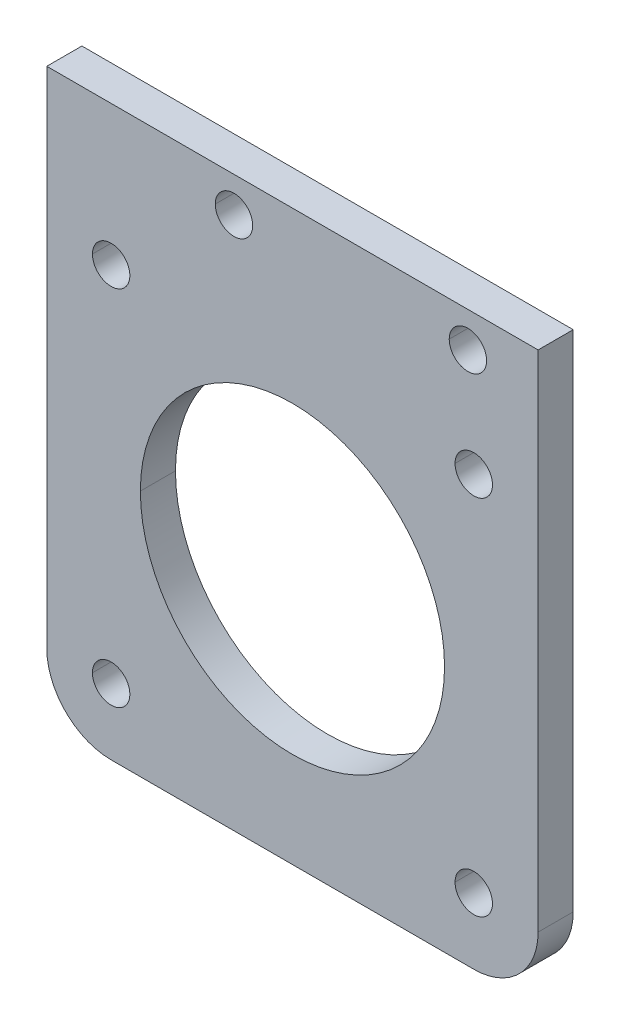
ISO-10303-21;
HEADER;
FILE_DESCRIPTION(('STEP AP214'),'2;1');
FILE_NAME('part.step','',(''),(''),'','','');
FILE_SCHEMA(('AUTOMOTIVE_DESIGN { 1 0 10303 214 1 1 1 1 }'));
ENDSEC;
DATA;
#1=APPLICATION_CONTEXT('core data for automotive mechanical design processes');
#2=APPLICATION_PROTOCOL_DEFINITION('international standard','automotive_design',2000,#1);
#3=PRODUCT_CONTEXT('',#1,'mechanical');
#4=PRODUCT('Part','Part','',(#3));
#5=PRODUCT_RELATED_PRODUCT_CATEGORY('part','',(#4));
#6=PRODUCT_DEFINITION_FORMATION('','',#4);
#7=PRODUCT_DEFINITION_CONTEXT('part definition',#1,'design');
#8=PRODUCT_DEFINITION('design','',#6,#7);
#9=PRODUCT_DEFINITION_SHAPE('','',#8);
#10=(LENGTH_UNIT() NAMED_UNIT(*) SI_UNIT(.MILLI.,.METRE.));
#11=(NAMED_UNIT(*) PLANE_ANGLE_UNIT() SI_UNIT($,.RADIAN.));
#12=(NAMED_UNIT(*) SI_UNIT($,.STERADIAN.) SOLID_ANGLE_UNIT());
#13=UNCERTAINTY_MEASURE_WITH_UNIT(LENGTH_MEASURE(1.E-05),#10,'distance_accuracy_value','');
#14=(GEOMETRIC_REPRESENTATION_CONTEXT(3) GLOBAL_UNCERTAINTY_ASSIGNED_CONTEXT((#13)) GLOBAL_UNIT_ASSIGNED_CONTEXT((#10,
#11,#12)) REPRESENTATION_CONTEXT('',''));
#15=CARTESIAN_POINT('',(0.,0.,0.));
#16=DIRECTION('',(0.,0.,1.));
#17=DIRECTION('',(1.,0.,0.));
#18=AXIS2_PLACEMENT_3D('',#15,#16,#17);
#19=CARTESIAN_POINT('',(-15.5,-15.65,10.));
#20=DIRECTION('',(0.,0.,-1.));
#21=DIRECTION('',(-1.,0.,0.));
#22=AXIS2_PLACEMENT_3D('',#19,#20,#21);
#23=CYLINDRICAL_SURFACE('',#22,5.5);
#24=CARTESIAN_POINT('',(-15.5,-15.65,3.));
#25=DIRECTION('',(0.,0.,1.));
#26=DIRECTION('',(1.,0.,0.));
#27=AXIS2_PLACEMENT_3D('',#24,#25,#26);
#28=CIRCLE('',#27,5.5);
#29=CARTESIAN_POINT('',(-21.,-15.65,3.));
#30=VERTEX_POINT('',#29);
#31=CARTESIAN_POINT('',(-15.5,-21.15,3.));
#32=VERTEX_POINT('',#31);
#33=EDGE_CURVE('E218',#30,#32,#28,.T.);
#34=ORIENTED_EDGE('',*,*,#33,.F.);
#35=DIRECTION('',(0.,0.,1.));
#36=VECTOR('',#35,1.);
#37=CARTESIAN_POINT('',(-21.,-15.65,3.));
#38=LINE('',#37,#36);
#39=CARTESIAN_POINT('',(-21.,-15.65,0.));
#40=VERTEX_POINT('',#39);
#41=EDGE_CURVE('E237',#40,#30,#38,.T.);
#42=ORIENTED_EDGE('',*,*,#41,.F.);
#43=CARTESIAN_POINT('',(-15.5,-15.65,0.));
#44=DIRECTION('',(0.,0.,-1.));
#45=DIRECTION('',(1.,0.,0.));
#46=AXIS2_PLACEMENT_3D('',#43,#44,#45);
#47=CIRCLE('',#46,5.5);
#48=CARTESIAN_POINT('',(-15.5,-21.15,0.));
#49=VERTEX_POINT('',#48);
#50=EDGE_CURVE('E245',#49,#40,#47,.T.);
#51=ORIENTED_EDGE('',*,*,#50,.F.);
#52=DIRECTION('',(0.,0.,-1.));
#53=VECTOR('',#52,1.);
#54=CARTESIAN_POINT('',(-15.5,-21.15,10.));
#55=LINE('',#54,#53);
#56=EDGE_CURVE('E11',#32,#49,#55,.T.);
#57=ORIENTED_EDGE('',*,*,#56,.F.);
#58=EDGE_LOOP('',(#34,#42,#51,#57));
#59=FACE_BOUND('',#58,.T.);
#60=ADVANCED_FACE('F17',(#59),#23,.T.);
#61=CARTESIAN_POINT('',(15.5,-15.65,3.));
#62=DIRECTION('',(0.,0.,1.));
#63=DIRECTION('',(1.,0.,0.));
#64=AXIS2_PLACEMENT_3D('',#61,#62,#63);
#65=CYLINDRICAL_SURFACE('',#64,5.5);
#66=CARTESIAN_POINT('',(15.5,-15.65,3.));
#67=DIRECTION('',(0.,0.,1.));
#68=DIRECTION('',(1.,0.,0.));
#69=AXIS2_PLACEMENT_3D('',#66,#67,#68);
#70=CIRCLE('',#69,5.5);
#71=CARTESIAN_POINT('',(15.5,-21.15,3.));
#72=VERTEX_POINT('',#71);
#73=CARTESIAN_POINT('',(21.,-15.65,3.));
#74=VERTEX_POINT('',#73);
#75=EDGE_CURVE('E21',#72,#74,#70,.T.);
#76=ORIENTED_EDGE('',*,*,#75,.F.);
#77=DIRECTION('',(0.,0.,1.));
#78=VECTOR('',#77,1.);
#79=CARTESIAN_POINT('',(15.5,-21.15,3.));
#80=LINE('',#79,#78);
#81=CARTESIAN_POINT('',(15.5,-21.15,0.));
#82=VERTEX_POINT('',#81);
#83=EDGE_CURVE('E28',#82,#72,#80,.T.);
#84=ORIENTED_EDGE('',*,*,#83,.F.);
#85=CARTESIAN_POINT('',(15.5,-15.65,0.));
#86=DIRECTION('',(0.,0.,-1.));
#87=DIRECTION('',(1.,0.,0.));
#88=AXIS2_PLACEMENT_3D('',#85,#86,#87);
#89=CIRCLE('',#88,5.5);
#90=CARTESIAN_POINT('',(21.,-15.65,0.));
#91=VERTEX_POINT('',#90);
#92=EDGE_CURVE('E246',#91,#82,#89,.T.);
#93=ORIENTED_EDGE('',*,*,#92,.F.);
#94=DIRECTION('',(0.,0.,-1.));
#95=VECTOR('',#94,1.);
#96=CARTESIAN_POINT('',(21.,-15.65,0.));
#97=LINE('',#96,#95);
#98=EDGE_CURVE('E209',#74,#91,#97,.T.);
#99=ORIENTED_EDGE('',*,*,#98,.F.);
#100=EDGE_LOOP('',(#76,#84,#93,#99));
#101=FACE_BOUND('',#100,.T.);
#102=ADVANCED_FACE('F207',(#101),#65,.T.);
#103=CARTESIAN_POINT('',(-4.99999999999984,24.4499999999959,10.));
#104=DIRECTION('',(0.,0.,-1.));
#105=DIRECTION('',(-1.,0.,0.));
#106=AXIS2_PLACEMENT_3D('',#103,#104,#105);
#107=CYLINDRICAL_SURFACE('',#106,1.6);
#108=DIRECTION('',(0.,0.,-1.));
#109=VECTOR('',#108,1.);
#110=CARTESIAN_POINT('',(-3.39999999999984,24.4499999999959,10.));
#111=LINE('',#110,#109);
#112=CARTESIAN_POINT('',(-3.39999999999984,24.4499999999959,3.));
#113=VERTEX_POINT('',#112);
#114=CARTESIAN_POINT('',(-3.39999999999984,24.4499999999959,0.));
#115=VERTEX_POINT('',#114);
#116=EDGE_CURVE('E242',#113,#115,#111,.T.);
#117=ORIENTED_EDGE('',*,*,#116,.F.);
#118=CARTESIAN_POINT('',(-4.99999999999984,24.4499999999959,3.));
#119=DIRECTION('',(0.,0.,1.));
#120=DIRECTION('',(1.,0.,0.));
#121=AXIS2_PLACEMENT_3D('',#118,#119,#120);
#122=CIRCLE('',#121,1.6);
#123=CARTESIAN_POINT('',(-6.59999999999984,24.4499999999959,3.));
#124=VERTEX_POINT('',#123);
#125=EDGE_CURVE('E282',#113,#124,#122,.T.);
#126=ORIENTED_EDGE('',*,*,#125,.T.);
#127=DIRECTION('',(0.,0.,-1.));
#128=VECTOR('',#127,1.);
#129=CARTESIAN_POINT('',(-6.59999999999984,24.4499999999959,10.));
#130=LINE('',#129,#128);
#131=CARTESIAN_POINT('',(-6.59999999999984,24.4499999999959,0.));
#132=VERTEX_POINT('',#131);
#133=EDGE_CURVE('E299',#124,#132,#130,.T.);
#134=ORIENTED_EDGE('',*,*,#133,.T.);
#135=CARTESIAN_POINT('',(-4.99999999999984,24.4499999999959,0.));
#136=DIRECTION('',(0.,0.,-1.));
#137=DIRECTION('',(-1.,0.,0.));
#138=AXIS2_PLACEMENT_3D('',#135,#136,#137);
#139=CIRCLE('',#138,1.6);
#140=EDGE_CURVE('E294',#132,#115,#139,.T.);
#141=ORIENTED_EDGE('',*,*,#140,.T.);
#142=EDGE_LOOP('',(#117,#126,#134,#141));
#143=FACE_BOUND('',#142,.T.);
#144=ADVANCED_FACE('F450',(#143),#107,.F.);
#145=CARTESIAN_POINT('',(15.,24.4499999999959,10.));
#146=DIRECTION('',(0.,0.,-1.));
#147=DIRECTION('',(-1.,0.,0.));
#148=AXIS2_PLACEMENT_3D('',#145,#146,#147);
#149=CYLINDRICAL_SURFACE('',#148,1.6);
#150=DIRECTION('',(0.,0.,-1.));
#151=VECTOR('',#150,1.);
#152=CARTESIAN_POINT('',(16.6,24.4499999999959,10.));
#153=LINE('',#152,#151);
#154=CARTESIAN_POINT('',(16.6,24.4499999999959,3.));
#155=VERTEX_POINT('',#154);
#156=CARTESIAN_POINT('',(16.6,24.4499999999959,0.));
#157=VERTEX_POINT('',#156);
#158=EDGE_CURVE('E273',#155,#157,#153,.T.);
#159=ORIENTED_EDGE('',*,*,#158,.F.);
#160=CARTESIAN_POINT('',(15.,24.4499999999959,3.));
#161=DIRECTION('',(0.,0.,1.));
#162=DIRECTION('',(1.,0.,0.));
#163=AXIS2_PLACEMENT_3D('',#160,#161,#162);
#164=CIRCLE('',#163,1.6);
#165=CARTESIAN_POINT('',(13.4000000000002,24.4499999999959,3.));
#166=VERTEX_POINT('',#165);
#167=EDGE_CURVE('E252',#155,#166,#164,.T.);
#168=ORIENTED_EDGE('',*,*,#167,.T.);
#169=DIRECTION('',(0.,0.,-1.));
#170=VECTOR('',#169,1.);
#171=CARTESIAN_POINT('',(13.4000000000002,24.4499999999959,10.));
#172=LINE('',#171,#170);
#173=CARTESIAN_POINT('',(13.4000000000002,24.4499999999959,0.));
#174=VERTEX_POINT('',#173);
#175=EDGE_CURVE('E228',#166,#174,#172,.T.);
#176=ORIENTED_EDGE('',*,*,#175,.T.);
#177=CARTESIAN_POINT('',(15.,24.4499999999959,0.));
#178=DIRECTION('',(0.,0.,-1.));
#179=DIRECTION('',(-1.,0.,0.));
#180=AXIS2_PLACEMENT_3D('',#177,#178,#179);
#181=CIRCLE('',#180,1.6);
#182=EDGE_CURVE('E278',#174,#157,#181,.T.);
#183=ORIENTED_EDGE('',*,*,#182,.T.);
#184=EDGE_LOOP('',(#159,#168,#176,#183));
#185=FACE_BOUND('',#184,.T.);
#186=ADVANCED_FACE('F490',(#185),#149,.F.);
#187=CARTESIAN_POINT('',(0.,27.45,3.000012));
#188=DIRECTION('',(0.,1.,0.));
#189=DIRECTION('',(1.,0.,0.));
#190=AXIS2_PLACEMENT_3D('',#187,#188,#189);
#191=PLANE('',#190);
#192=DIRECTION('',(0.,0.,-1.));
#193=VECTOR('',#192,1.);
#194=CARTESIAN_POINT('',(21.,27.45,3.000012));
#195=LINE('',#194,#193);
#196=CARTESIAN_POINT('',(21.,27.45,3.));
#197=VERTEX_POINT('',#196);
#198=CARTESIAN_POINT('',(21.,27.45,0.));
#199=VERTEX_POINT('',#198);
#200=EDGE_CURVE('E257',#197,#199,#195,.T.);
#201=ORIENTED_EDGE('',*,*,#200,.T.);
#202=DIRECTION('',(-1.,0.,0.));
#203=VECTOR('',#202,1.);
#204=CARTESIAN_POINT('',(0.,27.45,0.));
#205=LINE('',#204,#203);
#206=CARTESIAN_POINT('',(-21.,27.45,0.));
#207=VERTEX_POINT('',#206);
#208=EDGE_CURVE('E341',#199,#207,#205,.T.);
#209=ORIENTED_EDGE('',*,*,#208,.T.);
#210=DIRECTION('',(0.,0.,-1.));
#211=VECTOR('',#210,1.);
#212=CARTESIAN_POINT('',(-21.,27.45,3.000012));
#213=LINE('',#212,#211);
#214=CARTESIAN_POINT('',(-21.,27.45,3.));
#215=VERTEX_POINT('',#214);
#216=EDGE_CURVE('E220',#215,#207,#213,.T.);
#217=ORIENTED_EDGE('',*,*,#216,.F.);
#218=DIRECTION('',(-1.,0.,0.));
#219=VECTOR('',#218,1.);
#220=CARTESIAN_POINT('',(0.,27.45,3.));
#221=LINE('',#220,#219);
#222=EDGE_CURVE('E214',#197,#215,#221,.T.);
#223=ORIENTED_EDGE('',*,*,#222,.F.);
#224=EDGE_LOOP('',(#201,#209,#217,#223));
#225=FACE_BOUND('',#224,.T.);
#226=ADVANCED_FACE('F463',(#225),#191,.T.);
#227=CARTESIAN_POINT('',(0.,-21.15,10.));
#228=DIRECTION('',(0.,-1.,0.));
#229=DIRECTION('',(0.,0.,-1.));
#230=AXIS2_PLACEMENT_3D('',#227,#228,#229);
#231=PLANE('',#230);
#232=DIRECTION('',(-1.,0.,0.));
#233=VECTOR('',#232,1.);
#234=CARTESIAN_POINT('',(0.,-21.15,0.));
#235=LINE('',#234,#233);
#236=EDGE_CURVE('E200',#82,#49,#235,.T.);
#237=ORIENTED_EDGE('',*,*,#236,.F.);
#238=ORIENTED_EDGE('',*,*,#83,.T.);
#239=DIRECTION('',(1.,0.,0.));
#240=VECTOR('',#239,1.);
#241=CARTESIAN_POINT('',(0.,-21.15,3.));
#242=LINE('',#241,#240);
#243=EDGE_CURVE('E198',#32,#72,#242,.T.);
#244=ORIENTED_EDGE('',*,*,#243,.F.);
#245=ORIENTED_EDGE('',*,*,#56,.T.);
#246=EDGE_LOOP('',(#237,#238,#244,#245));
#247=FACE_BOUND('',#246,.T.);
#248=ADVANCED_FACE('F196',(#247),#231,.T.);
#249=CARTESIAN_POINT('',(0.,0.,3.));
#250=DIRECTION('',(0.,0.,-1.));
#251=DIRECTION('',(-1.,0.,0.));
#252=AXIS2_PLACEMENT_3D('',#249,#250,#251);
#253=CYLINDRICAL_SURFACE('',#252,13.);
#254=DIRECTION('',(0.,0.,-1.));
#255=VECTOR('',#254,1.);
#256=CARTESIAN_POINT('',(13.,0.,3.));
#257=LINE('',#256,#255);
#258=CARTESIAN_POINT('',(13.,0.,3.));
#259=VERTEX_POINT('',#258);
#260=CARTESIAN_POINT('',(13.,0.,0.));
#261=VERTEX_POINT('',#260);
#262=EDGE_CURVE('E316',#259,#261,#257,.T.);
#263=ORIENTED_EDGE('',*,*,#262,.F.);
#264=CARTESIAN_POINT('',(0.,0.,3.));
#265=DIRECTION('',(0.,0.,1.));
#266=DIRECTION('',(1.,0.,0.));
#267=AXIS2_PLACEMENT_3D('',#264,#265,#266);
#268=CIRCLE('',#267,13.);
#269=CARTESIAN_POINT('',(-13.,0.,3.));
#270=VERTEX_POINT('',#269);
#271=EDGE_CURVE('E308',#259,#270,#268,.T.);
#272=ORIENTED_EDGE('',*,*,#271,.T.);
#273=DIRECTION('',(0.,0.,-1.));
#274=VECTOR('',#273,1.);
#275=CARTESIAN_POINT('',(-13.,0.,3.));
#276=LINE('',#275,#274);
#277=CARTESIAN_POINT('',(-13.,0.,0.));
#278=VERTEX_POINT('',#277);
#279=EDGE_CURVE('E264',#270,#278,#276,.T.);
#280=ORIENTED_EDGE('',*,*,#279,.T.);
#281=CARTESIAN_POINT('',(0.,0.,0.));
#282=DIRECTION('',(0.,0.,1.));
#283=DIRECTION('',(1.,0.,0.));
#284=AXIS2_PLACEMENT_3D('',#281,#282,#283);
#285=CIRCLE('',#284,13.);
#286=EDGE_CURVE('E204',#261,#278,#285,.T.);
#287=ORIENTED_EDGE('',*,*,#286,.F.);
#288=EDGE_LOOP('',(#263,#272,#280,#287));
#289=FACE_BOUND('',#288,.T.);
#290=ADVANCED_FACE('F504',(#289),#253,.F.);
#291=CARTESIAN_POINT('',(15.5,-15.5,3.));
#292=DIRECTION('',(0.,0.,-1.));
#293=DIRECTION('',(-1.,0.,0.));
#294=AXIS2_PLACEMENT_3D('',#291,#292,#293);
#295=CYLINDRICAL_SURFACE('',#294,1.6);
#296=DIRECTION('',(0.,0.,-1.));
#297=VECTOR('',#296,1.);
#298=CARTESIAN_POINT('',(17.1,-15.5,3.));
#299=LINE('',#298,#297);
#300=CARTESIAN_POINT('',(17.1,-15.5,3.));
#301=VERTEX_POINT('',#300);
#302=CARTESIAN_POINT('',(17.1,-15.5,0.));
#303=VERTEX_POINT('',#302);
#304=EDGE_CURVE('E328',#301,#303,#299,.T.);
#305=ORIENTED_EDGE('',*,*,#304,.F.);
#306=CARTESIAN_POINT('',(15.5,-15.5,3.));
#307=DIRECTION('',(0.,0.,1.));
#308=DIRECTION('',(1.,0.,0.));
#309=AXIS2_PLACEMENT_3D('',#306,#307,#308);
#310=CIRCLE('',#309,1.6);
#311=CARTESIAN_POINT('',(13.9,-15.5,3.));
#312=VERTEX_POINT('',#311);
#313=EDGE_CURVE('E247',#301,#312,#310,.T.);
#314=ORIENTED_EDGE('',*,*,#313,.T.);
#315=DIRECTION('',(0.,0.,-1.));
#316=VECTOR('',#315,1.);
#317=CARTESIAN_POINT('',(13.9,-15.5,3.));
#318=LINE('',#317,#316);
#319=CARTESIAN_POINT('',(13.9,-15.5,0.));
#320=VERTEX_POINT('',#319);
#321=EDGE_CURVE('E331',#312,#320,#318,.T.);
#322=ORIENTED_EDGE('',*,*,#321,.T.);
#323=CARTESIAN_POINT('',(15.5,-15.5,0.));
#324=DIRECTION('',(0.,0.,1.));
#325=DIRECTION('',(1.,0.,0.));
#326=AXIS2_PLACEMENT_3D('',#323,#324,#325);
#327=CIRCLE('',#326,1.6);
#328=EDGE_CURVE('E274',#303,#320,#327,.T.);
#329=ORIENTED_EDGE('',*,*,#328,.F.);
#330=EDGE_LOOP('',(#305,#314,#322,#329));
#331=FACE_BOUND('',#330,.T.);
#332=ADVANCED_FACE('F528',(#331),#295,.F.);
#333=CARTESIAN_POINT('',(-15.5,15.5,3.));
#334=DIRECTION('',(0.,0.,-1.));
#335=DIRECTION('',(-1.,0.,0.));
#336=AXIS2_PLACEMENT_3D('',#333,#334,#335);
#337=CYLINDRICAL_SURFACE('',#336,1.6);
#338=DIRECTION('',(0.,0.,-1.));
#339=VECTOR('',#338,1.);
#340=CARTESIAN_POINT('',(-13.9,15.5,3.));
#341=LINE('',#340,#339);
#342=CARTESIAN_POINT('',(-13.9,15.5,3.));
#343=VERTEX_POINT('',#342);
#344=CARTESIAN_POINT('',(-13.9,15.5,0.));
#345=VERTEX_POINT('',#344);
#346=EDGE_CURVE('E353',#343,#345,#341,.T.);
#347=ORIENTED_EDGE('',*,*,#346,.F.);
#348=CARTESIAN_POINT('',(-15.5,15.5,3.));
#349=DIRECTION('',(0.,0.,1.));
#350=DIRECTION('',(1.,0.,0.));
#351=AXIS2_PLACEMENT_3D('',#348,#349,#350);
#352=CIRCLE('',#351,1.6);
#353=CARTESIAN_POINT('',(-17.1,15.5,3.));
#354=VERTEX_POINT('',#353);
#355=EDGE_CURVE('E251',#343,#354,#352,.T.);
#356=ORIENTED_EDGE('',*,*,#355,.T.);
#357=DIRECTION('',(0.,0.,-1.));
#358=VECTOR('',#357,1.);
#359=CARTESIAN_POINT('',(-17.1,15.5,3.));
#360=LINE('',#359,#358);
#361=CARTESIAN_POINT('',(-17.1,15.5,0.));
#362=VERTEX_POINT('',#361);
#363=EDGE_CURVE('E342',#354,#362,#360,.T.);
#364=ORIENTED_EDGE('',*,*,#363,.T.);
#365=CARTESIAN_POINT('',(-15.5,15.5,0.));
#366=DIRECTION('',(0.,0.,1.));
#367=DIRECTION('',(1.,0.,0.));
#368=AXIS2_PLACEMENT_3D('',#365,#366,#367);
#369=CIRCLE('',#368,1.6);
#370=EDGE_CURVE('E277',#345,#362,#369,.T.);
#371=ORIENTED_EDGE('',*,*,#370,.F.);
#372=EDGE_LOOP('',(#347,#356,#364,#371));
#373=FACE_BOUND('',#372,.T.);
#374=ADVANCED_FACE('F427',(#373),#337,.F.);
#375=CARTESIAN_POINT('',(15.5,15.5,3.));
#376=DIRECTION('',(0.,0.,-1.));
#377=DIRECTION('',(-1.,0.,0.));
#378=AXIS2_PLACEMENT_3D('',#375,#376,#377);
#379=CYLINDRICAL_SURFACE('',#378,1.6);
#380=DIRECTION('',(0.,0.,-1.));
#381=VECTOR('',#380,1.);
#382=CARTESIAN_POINT('',(17.1,15.5,3.));
#383=LINE('',#382,#381);
#384=CARTESIAN_POINT('',(17.1,15.5,3.));
#385=VERTEX_POINT('',#384);
#386=CARTESIAN_POINT('',(17.1,15.5,0.));
#387=VERTEX_POINT('',#386);
#388=EDGE_CURVE('E364',#385,#387,#383,.T.);
#389=ORIENTED_EDGE('',*,*,#388,.F.);
#390=CARTESIAN_POINT('',(15.5,15.5,3.));
#391=DIRECTION('',(0.,0.,1.));
#392=DIRECTION('',(1.,0.,0.));
#393=AXIS2_PLACEMENT_3D('',#390,#391,#392);
#394=CIRCLE('',#393,1.6);
#395=CARTESIAN_POINT('',(13.9,15.5,3.));
#396=VERTEX_POINT('',#395);
#397=EDGE_CURVE('E189',#385,#396,#394,.T.);
#398=ORIENTED_EDGE('',*,*,#397,.T.);
#399=DIRECTION('',(0.,0.,-1.));
#400=VECTOR('',#399,1.);
#401=CARTESIAN_POINT('',(13.9,15.5,3.));
#402=LINE('',#401,#400);
#403=CARTESIAN_POINT('',(13.9,15.5,0.));
#404=VERTEX_POINT('',#403);
#405=EDGE_CURVE('E263',#396,#404,#402,.T.);
#406=ORIENTED_EDGE('',*,*,#405,.T.);
#407=CARTESIAN_POINT('',(15.5,15.5,0.));
#408=DIRECTION('',(0.,0.,1.));
#409=DIRECTION('',(1.,0.,0.));
#410=AXIS2_PLACEMENT_3D('',#407,#408,#409);
#411=CIRCLE('',#410,1.6);
#412=EDGE_CURVE('E176',#387,#404,#411,.T.);
#413=ORIENTED_EDGE('',*,*,#412,.F.);
#414=EDGE_LOOP('',(#389,#398,#406,#413));
#415=FACE_BOUND('',#414,.T.);
#416=ADVANCED_FACE('F19',(#415),#379,.F.);
#417=CARTESIAN_POINT('',(-15.5,-15.5,3.));
#418=DIRECTION('',(0.,0.,-1.));
#419=DIRECTION('',(-1.,0.,0.));
#420=AXIS2_PLACEMENT_3D('',#417,#418,#419);
#421=CYLINDRICAL_SURFACE('',#420,1.6);
#422=DIRECTION('',(0.,0.,-1.));
#423=VECTOR('',#422,1.);
#424=CARTESIAN_POINT('',(-13.9,-15.5,3.));
#425=LINE('',#424,#423);
#426=CARTESIAN_POINT('',(-13.9,-15.5,3.));
#427=VERTEX_POINT('',#426);
#428=CARTESIAN_POINT('',(-13.9,-15.5,0.));
#429=VERTEX_POINT('',#428);
#430=EDGE_CURVE('E262',#427,#429,#425,.T.);
#431=ORIENTED_EDGE('',*,*,#430,.F.);
#432=CARTESIAN_POINT('',(-15.5,-15.5,3.));
#433=DIRECTION('',(0.,0.,1.));
#434=DIRECTION('',(1.,0.,0.));
#435=AXIS2_PLACEMENT_3D('',#432,#433,#434);
#436=CIRCLE('',#435,1.6);
#437=CARTESIAN_POINT('',(-17.1,-15.5,3.));
#438=VERTEX_POINT('',#437);
#439=EDGE_CURVE('E304',#427,#438,#436,.T.);
#440=ORIENTED_EDGE('',*,*,#439,.T.);
#441=DIRECTION('',(0.,0.,-1.));
#442=VECTOR('',#441,1.);
#443=CARTESIAN_POINT('',(-17.1,-15.5,3.));
#444=LINE('',#443,#442);
#445=CARTESIAN_POINT('',(-17.1,-15.5,0.));
#446=VERTEX_POINT('',#445);
#447=EDGE_CURVE('E303',#438,#446,#444,.T.);
#448=ORIENTED_EDGE('',*,*,#447,.T.);
#449=CARTESIAN_POINT('',(-15.5,-15.5,0.));
#450=DIRECTION('',(0.,0.,1.));
#451=DIRECTION('',(1.,0.,0.));
#452=AXIS2_PLACEMENT_3D('',#449,#450,#451);
#453=CIRCLE('',#452,1.6);
#454=EDGE_CURVE('E321',#429,#446,#453,.T.);
#455=ORIENTED_EDGE('',*,*,#454,.F.);
#456=EDGE_LOOP('',(#431,#440,#448,#455));
#457=FACE_BOUND('',#456,.T.);
#458=ADVANCED_FACE('F454',(#457),#421,.F.);
#459=CARTESIAN_POINT('',(0.,0.,0.));
#460=DIRECTION('',(0.,0.,1.));
#461=DIRECTION('',(1.,0.,0.));
#462=AXIS2_PLACEMENT_3D('',#459,#460,#461);
#463=PLANE('',#462);
#464=CARTESIAN_POINT('',(0.,0.,0.));
#465=DIRECTION('',(0.,0.,1.));
#466=DIRECTION('',(1.,0.,0.));
#467=AXIS2_PLACEMENT_3D('',#464,#465,#466);
#468=CIRCLE('',#467,13.);
#469=EDGE_CURVE('E269',#278,#261,#468,.T.);
#470=ORIENTED_EDGE('',*,*,#469,.T.);
#471=ORIENTED_EDGE('',*,*,#286,.T.);
#472=EDGE_LOOP('',(#470,#471));
#473=FACE_BOUND('',#472,.T.);
#474=CARTESIAN_POINT('',(-15.5,-15.5,0.));
#475=DIRECTION('',(0.,0.,1.));
#476=DIRECTION('',(1.,0.,0.));
#477=AXIS2_PLACEMENT_3D('',#474,#475,#476);
#478=CIRCLE('',#477,1.6);
#479=EDGE_CURVE('E357',#446,#429,#478,.T.);
#480=ORIENTED_EDGE('',*,*,#479,.T.);
#481=ORIENTED_EDGE('',*,*,#454,.T.);
#482=EDGE_LOOP('',(#480,#481));
#483=FACE_BOUND('',#482,.T.);
#484=CARTESIAN_POINT('',(15.5,15.5,0.));
#485=DIRECTION('',(0.,0.,1.));
#486=DIRECTION('',(1.,0.,0.));
#487=AXIS2_PLACEMENT_3D('',#484,#485,#486);
#488=CIRCLE('',#487,1.6);
#489=EDGE_CURVE('E285',#404,#387,#488,.T.);
#490=ORIENTED_EDGE('',*,*,#489,.T.);
#491=ORIENTED_EDGE('',*,*,#412,.T.);
#492=EDGE_LOOP('',(#490,#491));
#493=FACE_BOUND('',#492,.T.);
#494=CARTESIAN_POINT('',(-15.5,15.5,0.));
#495=DIRECTION('',(0.,0.,1.));
#496=DIRECTION('',(1.,0.,0.));
#497=AXIS2_PLACEMENT_3D('',#494,#495,#496);
#498=CIRCLE('',#497,1.6);
#499=EDGE_CURVE('E347',#362,#345,#498,.T.);
#500=ORIENTED_EDGE('',*,*,#499,.T.);
#501=ORIENTED_EDGE('',*,*,#370,.T.);
#502=EDGE_LOOP('',(#500,#501));
#503=FACE_BOUND('',#502,.T.);
#504=CARTESIAN_POINT('',(15.5,-15.5,0.));
#505=DIRECTION('',(0.,0.,1.));
#506=DIRECTION('',(1.,0.,0.));
#507=AXIS2_PLACEMENT_3D('',#504,#505,#506);
#508=CIRCLE('',#507,1.6);
#509=EDGE_CURVE('E336',#320,#303,#508,.T.);
#510=ORIENTED_EDGE('',*,*,#509,.T.);
#511=ORIENTED_EDGE('',*,*,#328,.T.);
#512=EDGE_LOOP('',(#510,#511));
#513=FACE_BOUND('',#512,.T.);
#514=ORIENTED_EDGE('',*,*,#182,.F.);
#515=CARTESIAN_POINT('',(15.,24.4499999999959,0.));
#516=DIRECTION('',(0.,0.,-1.));
#517=DIRECTION('',(-1.,0.,0.));
#518=AXIS2_PLACEMENT_3D('',#515,#516,#517);
#519=CIRCLE('',#518,1.6);
#520=EDGE_CURVE('E233',#157,#174,#519,.T.);
#521=ORIENTED_EDGE('',*,*,#520,.F.);
#522=EDGE_LOOP('',(#514,#521));
#523=FACE_BOUND('',#522,.T.);
#524=ORIENTED_EDGE('',*,*,#140,.F.);
#525=CARTESIAN_POINT('',(-4.99999999999984,24.4499999999959,0.));
#526=DIRECTION('',(0.,0.,-1.));
#527=DIRECTION('',(-1.,0.,0.));
#528=AXIS2_PLACEMENT_3D('',#525,#526,#527);
#529=CIRCLE('',#528,1.6);
#530=EDGE_CURVE('E295',#115,#132,#529,.T.);
#531=ORIENTED_EDGE('',*,*,#530,.F.);
#532=EDGE_LOOP('',(#524,#531));
#533=FACE_BOUND('',#532,.T.);
#534=DIRECTION('',(0.,1.,0.));
#535=VECTOR('',#534,1.);
#536=CARTESIAN_POINT('',(21.,0.,0.));
#537=LINE('',#536,#535);
#538=EDGE_CURVE('E312',#91,#199,#537,.T.);
#539=ORIENTED_EDGE('',*,*,#538,.F.);
#540=ORIENTED_EDGE('',*,*,#92,.T.);
#541=ORIENTED_EDGE('',*,*,#236,.T.);
#542=ORIENTED_EDGE('',*,*,#50,.T.);
#543=DIRECTION('',(0.,1.,0.));
#544=VECTOR('',#543,1.);
#545=CARTESIAN_POINT('',(-21.,0.,0.));
#546=LINE('',#545,#544);
#547=EDGE_CURVE('E253',#40,#207,#546,.T.);
#548=ORIENTED_EDGE('',*,*,#547,.T.);
#549=ORIENTED_EDGE('',*,*,#208,.F.);
#550=EDGE_LOOP('',(#539,#540,#541,#542,#548,#549));
#551=FACE_BOUND('',#550,.T.);
#552=ADVANCED_FACE('F421',(#473,#483,#493,#503,#513,#523,#533,#551),#463,.F.);
#553=CARTESIAN_POINT('',(0.,0.,3.));
#554=DIRECTION('',(0.,0.,1.));
#555=DIRECTION('',(1.,0.,0.));
#556=AXIS2_PLACEMENT_3D('',#553,#554,#555);
#557=PLANE('',#556);
#558=CARTESIAN_POINT('',(0.,0.,3.));
#559=DIRECTION('',(0.,0.,1.));
#560=DIRECTION('',(1.,0.,0.));
#561=AXIS2_PLACEMENT_3D('',#558,#559,#560);
#562=CIRCLE('',#561,13.);
#563=EDGE_CURVE('E232',#270,#259,#562,.T.);
#564=ORIENTED_EDGE('',*,*,#563,.F.);
#565=ORIENTED_EDGE('',*,*,#271,.F.);
#566=EDGE_LOOP('',(#564,#565));
#567=FACE_BOUND('',#566,.T.);
#568=CARTESIAN_POINT('',(-15.5,-15.5,3.));
#569=DIRECTION('',(0.,0.,1.));
#570=DIRECTION('',(1.,0.,0.));
#571=AXIS2_PLACEMENT_3D('',#568,#569,#570);
#572=CIRCLE('',#571,1.6);
#573=EDGE_CURVE('E258',#438,#427,#572,.T.);
#574=ORIENTED_EDGE('',*,*,#573,.F.);
#575=ORIENTED_EDGE('',*,*,#439,.F.);
#576=EDGE_LOOP('',(#574,#575));
#577=FACE_BOUND('',#576,.T.);
#578=CARTESIAN_POINT('',(15.5,15.5,3.));
#579=DIRECTION('',(0.,0.,1.));
#580=DIRECTION('',(1.,0.,0.));
#581=AXIS2_PLACEMENT_3D('',#578,#579,#580);
#582=CIRCLE('',#581,1.6);
#583=EDGE_CURVE('E346',#396,#385,#582,.T.);
#584=ORIENTED_EDGE('',*,*,#583,.F.);
#585=ORIENTED_EDGE('',*,*,#397,.F.);
#586=EDGE_LOOP('',(#584,#585));
#587=FACE_BOUND('',#586,.T.);
#588=CARTESIAN_POINT('',(-15.5,15.5,3.));
#589=DIRECTION('',(0.,0.,1.));
#590=DIRECTION('',(1.,0.,0.));
#591=AXIS2_PLACEMENT_3D('',#588,#589,#590);
#592=CIRCLE('',#591,1.6);
#593=EDGE_CURVE('E335',#354,#343,#592,.T.);
#594=ORIENTED_EDGE('',*,*,#593,.F.);
#595=ORIENTED_EDGE('',*,*,#355,.F.);
#596=EDGE_LOOP('',(#594,#595));
#597=FACE_BOUND('',#596,.T.);
#598=CARTESIAN_POINT('',(15.5,-15.5,3.));
#599=DIRECTION('',(0.,0.,1.));
#600=DIRECTION('',(1.,0.,0.));
#601=AXIS2_PLACEMENT_3D('',#598,#599,#600);
#602=CIRCLE('',#601,1.6);
#603=EDGE_CURVE('E268',#312,#301,#602,.T.);
#604=ORIENTED_EDGE('',*,*,#603,.F.);
#605=ORIENTED_EDGE('',*,*,#313,.F.);
#606=EDGE_LOOP('',(#604,#605));
#607=FACE_BOUND('',#606,.T.);
#608=CARTESIAN_POINT('',(15.,24.4499999999959,3.));
#609=DIRECTION('',(0.,0.,1.));
#610=DIRECTION('',(1.,0.,0.));
#611=AXIS2_PLACEMENT_3D('',#608,#609,#610);
#612=CIRCLE('',#611,1.6);
#613=EDGE_CURVE('E289',#166,#155,#612,.T.);
#614=ORIENTED_EDGE('',*,*,#613,.F.);
#615=ORIENTED_EDGE('',*,*,#167,.F.);
#616=EDGE_LOOP('',(#614,#615));
#617=FACE_BOUND('',#616,.T.);
#618=CARTESIAN_POINT('',(-4.99999999999984,24.4499999999959,3.));
#619=DIRECTION('',(0.,0.,1.));
#620=DIRECTION('',(1.,0.,0.));
#621=AXIS2_PLACEMENT_3D('',#618,#619,#620);
#622=CIRCLE('',#621,1.6);
#623=EDGE_CURVE('E238',#124,#113,#622,.T.);
#624=ORIENTED_EDGE('',*,*,#623,.F.);
#625=ORIENTED_EDGE('',*,*,#125,.F.);
#626=EDGE_LOOP('',(#624,#625));
#627=FACE_BOUND('',#626,.T.);
#628=ORIENTED_EDGE('',*,*,#243,.T.);
#629=ORIENTED_EDGE('',*,*,#75,.T.);
#630=DIRECTION('',(0.,1.,0.));
#631=VECTOR('',#630,1.);
#632=CARTESIAN_POINT('',(21.,0.,3.));
#633=LINE('',#632,#631);
#634=EDGE_CURVE('E300',#74,#197,#633,.T.);
#635=ORIENTED_EDGE('',*,*,#634,.T.);
#636=ORIENTED_EDGE('',*,*,#222,.T.);
#637=DIRECTION('',(0.,1.,0.));
#638=VECTOR('',#637,1.);
#639=CARTESIAN_POINT('',(-21.,0.,3.));
#640=LINE('',#639,#638);
#641=EDGE_CURVE('E225',#30,#215,#640,.T.);
#642=ORIENTED_EDGE('',*,*,#641,.F.);
#643=ORIENTED_EDGE('',*,*,#33,.T.);
#644=EDGE_LOOP('',(#628,#629,#635,#636,#642,#643));
#645=FACE_BOUND('',#644,.T.);
#646=ADVANCED_FACE('F216',(#567,#577,#587,#597,#607,#617,#627,#645),#557,.T.);
#647=CARTESIAN_POINT('',(-21.,0.,3.));
#648=DIRECTION('',(-1.,0.,0.));
#649=DIRECTION('',(0.,0.,1.));
#650=AXIS2_PLACEMENT_3D('',#647,#648,#649);
#651=PLANE('',#650);
#652=ORIENTED_EDGE('',*,*,#547,.F.);
#653=ORIENTED_EDGE('',*,*,#41,.T.);
#654=ORIENTED_EDGE('',*,*,#641,.T.);
#655=ORIENTED_EDGE('',*,*,#216,.T.);
#656=EDGE_LOOP('',(#652,#653,#654,#655));
#657=FACE_BOUND('',#656,.T.);
#658=ADVANCED_FACE('F434',(#657),#651,.T.);
#659=CARTESIAN_POINT('',(21.,0.,3.));
#660=DIRECTION('',(-1.,0.,0.));
#661=DIRECTION('',(0.,0.,1.));
#662=AXIS2_PLACEMENT_3D('',#659,#660,#661);
#663=PLANE('',#662);
#664=ORIENTED_EDGE('',*,*,#634,.F.);
#665=ORIENTED_EDGE('',*,*,#98,.T.);
#666=ORIENTED_EDGE('',*,*,#538,.T.);
#667=ORIENTED_EDGE('',*,*,#200,.F.);
#668=EDGE_LOOP('',(#664,#665,#666,#667));
#669=FACE_BOUND('',#668,.T.);
#670=ADVANCED_FACE('F460',(#669),#663,.F.);
#671=CARTESIAN_POINT('',(-15.5,-15.5,3.));
#672=DIRECTION('',(0.,0.,-1.));
#673=DIRECTION('',(-1.,0.,0.));
#674=AXIS2_PLACEMENT_3D('',#671,#672,#673);
#675=CYLINDRICAL_SURFACE('',#674,1.6);
#676=ORIENTED_EDGE('',*,*,#573,.T.);
#677=ORIENTED_EDGE('',*,*,#430,.T.);
#678=ORIENTED_EDGE('',*,*,#479,.F.);
#679=ORIENTED_EDGE('',*,*,#447,.F.);
#680=EDGE_LOOP('',(#676,#677,#678,#679));
#681=FACE_BOUND('',#680,.T.);
#682=ADVANCED_FACE('F479',(#681),#675,.F.);
#683=CARTESIAN_POINT('',(15.5,15.5,3.));
#684=DIRECTION('',(0.,0.,-1.));
#685=DIRECTION('',(-1.,0.,0.));
#686=AXIS2_PLACEMENT_3D('',#683,#684,#685);
#687=CYLINDRICAL_SURFACE('',#686,1.6);
#688=ORIENTED_EDGE('',*,*,#583,.T.);
#689=ORIENTED_EDGE('',*,*,#388,.T.);
#690=ORIENTED_EDGE('',*,*,#489,.F.);
#691=ORIENTED_EDGE('',*,*,#405,.F.);
#692=EDGE_LOOP('',(#688,#689,#690,#691));
#693=FACE_BOUND('',#692,.T.);
#694=ADVANCED_FACE('F589',(#693),#687,.F.);
#695=CARTESIAN_POINT('',(-15.5,15.5,3.));
#696=DIRECTION('',(0.,0.,-1.));
#697=DIRECTION('',(-1.,0.,0.));
#698=AXIS2_PLACEMENT_3D('',#695,#696,#697);
#699=CYLINDRICAL_SURFACE('',#698,1.6);
#700=ORIENTED_EDGE('',*,*,#593,.T.);
#701=ORIENTED_EDGE('',*,*,#346,.T.);
#702=ORIENTED_EDGE('',*,*,#499,.F.);
#703=ORIENTED_EDGE('',*,*,#363,.F.);
#704=EDGE_LOOP('',(#700,#701,#702,#703));
#705=FACE_BOUND('',#704,.T.);
#706=ADVANCED_FACE('F430',(#705),#699,.F.);
#707=CARTESIAN_POINT('',(15.5,-15.5,3.));
#708=DIRECTION('',(0.,0.,-1.));
#709=DIRECTION('',(-1.,0.,0.));
#710=AXIS2_PLACEMENT_3D('',#707,#708,#709);
#711=CYLINDRICAL_SURFACE('',#710,1.6);
#712=ORIENTED_EDGE('',*,*,#603,.T.);
#713=ORIENTED_EDGE('',*,*,#304,.T.);
#714=ORIENTED_EDGE('',*,*,#509,.F.);
#715=ORIENTED_EDGE('',*,*,#321,.F.);
#716=EDGE_LOOP('',(#712,#713,#714,#715));
#717=FACE_BOUND('',#716,.T.);
#718=ADVANCED_FACE('F486',(#717),#711,.F.);
#719=CARTESIAN_POINT('',(0.,0.,3.));
#720=DIRECTION('',(0.,0.,-1.));
#721=DIRECTION('',(-1.,0.,0.));
#722=AXIS2_PLACEMENT_3D('',#719,#720,#721);
#723=CYLINDRICAL_SURFACE('',#722,13.);
#724=ORIENTED_EDGE('',*,*,#563,.T.);
#725=ORIENTED_EDGE('',*,*,#262,.T.);
#726=ORIENTED_EDGE('',*,*,#469,.F.);
#727=ORIENTED_EDGE('',*,*,#279,.F.);
#728=EDGE_LOOP('',(#724,#725,#726,#727));
#729=FACE_BOUND('',#728,.T.);
#730=ADVANCED_FACE('F483',(#729),#723,.F.);
#731=CARTESIAN_POINT('',(15.,24.4499999999959,10.));
#732=DIRECTION('',(0.,0.,-1.));
#733=DIRECTION('',(-1.,0.,0.));
#734=AXIS2_PLACEMENT_3D('',#731,#732,#733);
#735=CYLINDRICAL_SURFACE('',#734,1.6);
#736=ORIENTED_EDGE('',*,*,#613,.T.);
#737=ORIENTED_EDGE('',*,*,#158,.T.);
#738=ORIENTED_EDGE('',*,*,#520,.T.);
#739=ORIENTED_EDGE('',*,*,#175,.F.);
#740=EDGE_LOOP('',(#736,#737,#738,#739));
#741=FACE_BOUND('',#740,.T.);
#742=ADVANCED_FACE('F482',(#741),#735,.F.);
#743=CARTESIAN_POINT('',(-4.99999999999984,24.4499999999959,10.));
#744=DIRECTION('',(0.,0.,-1.));
#745=DIRECTION('',(-1.,0.,0.));
#746=AXIS2_PLACEMENT_3D('',#743,#744,#745);
#747=CYLINDRICAL_SURFACE('',#746,1.6);
#748=ORIENTED_EDGE('',*,*,#623,.T.);
#749=ORIENTED_EDGE('',*,*,#116,.T.);
#750=ORIENTED_EDGE('',*,*,#530,.T.);
#751=ORIENTED_EDGE('',*,*,#133,.F.);
#752=EDGE_LOOP('',(#748,#749,#750,#751));
#753=FACE_BOUND('',#752,.T.);
#754=ADVANCED_FACE('F447',(#753),#747,.F.);
#755=CLOSED_SHELL('',(#60,#102,#144,#186,#226,#248,#290,#332,#374,#416,#458,#552,#646,#658,#670,
#682,#694,#706,#718,#730,#742,#754));
#756=MANIFOLD_SOLID_BREP('B1',#755);
#757=ADVANCED_BREP_SHAPE_REPRESENTATION('',(#18,#756),#14);
#758=SHAPE_DEFINITION_REPRESENTATION(#9,#757);
ENDSEC;
END-ISO-10303-21;
